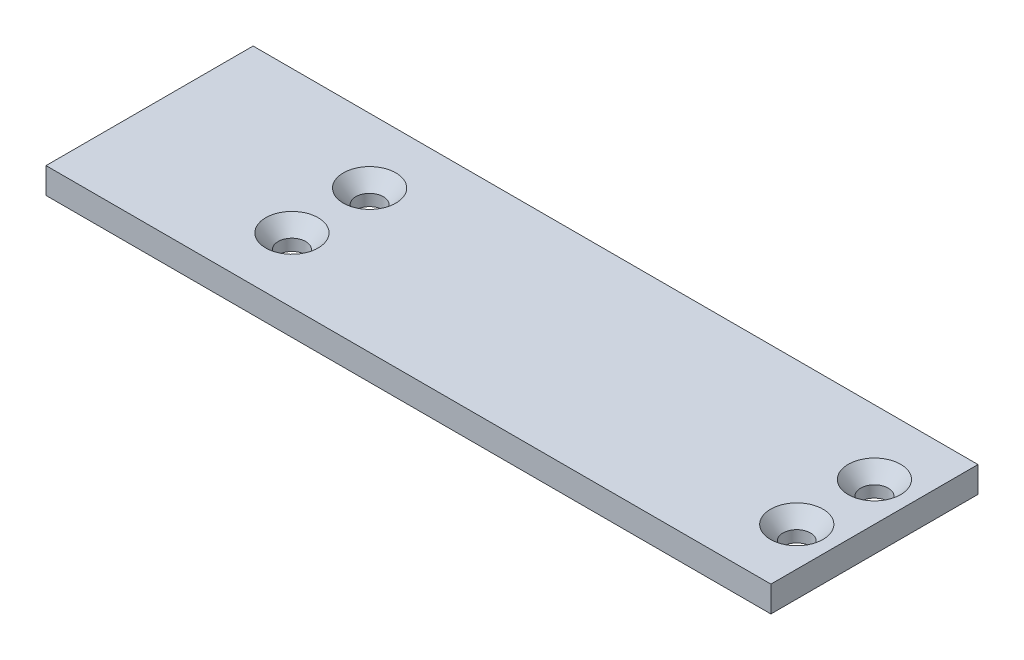
ISO-10303-21;
HEADER;
FILE_DESCRIPTION(('STEP AP214'),'2;1');
FILE_NAME('part.step','',(''),(''),'','','');
FILE_SCHEMA(('AUTOMOTIVE_DESIGN { 1 0 10303 214 1 1 1 1 }'));
ENDSEC;
DATA;
#1=APPLICATION_CONTEXT('core data for automotive mechanical design processes');
#2=APPLICATION_PROTOCOL_DEFINITION('international standard','automotive_design',2000,#1);
#3=PRODUCT_CONTEXT('',#1,'mechanical');
#4=PRODUCT('Part','Part','',(#3));
#5=PRODUCT_RELATED_PRODUCT_CATEGORY('part','',(#4));
#6=PRODUCT_DEFINITION_FORMATION('','',#4);
#7=PRODUCT_DEFINITION_CONTEXT('part definition',#1,'design');
#8=PRODUCT_DEFINITION('design','',#6,#7);
#9=PRODUCT_DEFINITION_SHAPE('','',#8);
#10=(LENGTH_UNIT() NAMED_UNIT(*) SI_UNIT(.MILLI.,.METRE.));
#11=(NAMED_UNIT(*) PLANE_ANGLE_UNIT() SI_UNIT($,.RADIAN.));
#12=(NAMED_UNIT(*) SI_UNIT($,.STERADIAN.) SOLID_ANGLE_UNIT());
#13=UNCERTAINTY_MEASURE_WITH_UNIT(LENGTH_MEASURE(1.E-05),#10,'distance_accuracy_value','');
#14=(GEOMETRIC_REPRESENTATION_CONTEXT(3) GLOBAL_UNCERTAINTY_ASSIGNED_CONTEXT((#13)) GLOBAL_UNIT_ASSIGNED_CONTEXT((#10,
#11,#12)) REPRESENTATION_CONTEXT('',''));
#15=CARTESIAN_POINT('',(0.,0.,0.));
#16=DIRECTION('',(0.,0.,1.));
#17=DIRECTION('',(1.,0.,0.));
#18=AXIS2_PLACEMENT_3D('',#15,#16,#17);
#19=CARTESIAN_POINT('',(-88.9,3.175,25.4));
#20=DIRECTION('',(1.,0.,0.));
#21=DIRECTION('',(0.,0.,-1.));
#22=AXIS2_PLACEMENT_3D('',#19,#20,#21);
#23=PLANE('',#22);
#24=DIRECTION('',(0.,0.,1.));
#25=VECTOR('',#24,1.);
#26=CARTESIAN_POINT('',(-88.9,-3.175,25.4));
#27=LINE('',#26,#25);
#28=CARTESIAN_POINT('',(-88.9,-3.175,-25.4));
#29=VERTEX_POINT('',#28);
#30=CARTESIAN_POINT('',(-88.9,-3.175,25.4));
#31=VERTEX_POINT('',#30);
#32=EDGE_CURVE('E98',#29,#31,#27,.T.);
#33=ORIENTED_EDGE('',*,*,#32,.T.);
#34=DIRECTION('',(0.,-1.,0.));
#35=VECTOR('',#34,1.);
#36=CARTESIAN_POINT('',(-88.9,3.175,25.4));
#37=LINE('',#36,#35);
#38=CARTESIAN_POINT('',(-88.9,3.175,25.4));
#39=VERTEX_POINT('',#38);
#40=EDGE_CURVE('E11',#39,#31,#37,.T.);
#41=ORIENTED_EDGE('',*,*,#40,.F.);
#42=DIRECTION('',(0.,0.,1.));
#43=VECTOR('',#42,1.);
#44=CARTESIAN_POINT('',(-88.9,3.175,25.4));
#45=LINE('',#44,#43);
#46=CARTESIAN_POINT('',(-88.9,3.175,-25.4));
#47=VERTEX_POINT('',#46);
#48=EDGE_CURVE('E85',#47,#39,#45,.T.);
#49=ORIENTED_EDGE('',*,*,#48,.F.);
#50=DIRECTION('',(0.,-1.,0.));
#51=VECTOR('',#50,1.);
#52=CARTESIAN_POINT('',(-88.9,3.175,-25.4));
#53=LINE('',#52,#51);
#54=EDGE_CURVE('E94',#47,#29,#53,.T.);
#55=ORIENTED_EDGE('',*,*,#54,.T.);
#56=EDGE_LOOP('',(#33,#41,#49,#55));
#57=FACE_BOUND('',#56,.T.);
#58=ADVANCED_FACE('F32',(#57),#23,.F.);
#59=CARTESIAN_POINT('',(88.9,3.175,25.4));
#60=DIRECTION('',(0.,0.,-1.));
#61=DIRECTION('',(-1.,0.,0.));
#62=AXIS2_PLACEMENT_3D('',#59,#60,#61);
#63=PLANE('',#62);
#64=DIRECTION('',(1.,0.,0.));
#65=VECTOR('',#64,1.);
#66=CARTESIAN_POINT('',(88.9,-3.175,25.4));
#67=LINE('',#66,#65);
#68=CARTESIAN_POINT('',(88.9,-3.175,25.4));
#69=VERTEX_POINT('',#68);
#70=EDGE_CURVE('E89',#31,#69,#67,.T.);
#71=ORIENTED_EDGE('',*,*,#70,.T.);
#72=DIRECTION('',(0.,-1.,0.));
#73=VECTOR('',#72,1.);
#74=CARTESIAN_POINT('',(88.9,3.175,25.4));
#75=LINE('',#74,#73);
#76=CARTESIAN_POINT('',(88.9,3.175,25.4));
#77=VERTEX_POINT('',#76);
#78=EDGE_CURVE('E41',#77,#69,#75,.T.);
#79=ORIENTED_EDGE('',*,*,#78,.F.);
#80=DIRECTION('',(1.,0.,0.));
#81=VECTOR('',#80,1.);
#82=CARTESIAN_POINT('',(88.9,3.175,25.4));
#83=LINE('',#82,#81);
#84=EDGE_CURVE('E80',#39,#77,#83,.T.);
#85=ORIENTED_EDGE('',*,*,#84,.F.);
#86=ORIENTED_EDGE('',*,*,#40,.T.);
#87=EDGE_LOOP('',(#71,#79,#85,#86));
#88=FACE_BOUND('',#87,.T.);
#89=ADVANCED_FACE('F88',(#88),#63,.F.);
#90=CARTESIAN_POINT('',(88.9,3.175,25.4));
#91=DIRECTION('',(-1.,0.,0.));
#92=DIRECTION('',(0.,0.,1.));
#93=AXIS2_PLACEMENT_3D('',#90,#91,#92);
#94=PLANE('',#93);
#95=DIRECTION('',(0.,0.,-1.));
#96=VECTOR('',#95,1.);
#97=CARTESIAN_POINT('',(88.9,-3.175,25.4));
#98=LINE('',#97,#96);
#99=CARTESIAN_POINT('',(88.9,-3.175,-25.4));
#100=VERTEX_POINT('',#99);
#101=EDGE_CURVE('E67',#69,#100,#98,.T.);
#102=ORIENTED_EDGE('',*,*,#101,.T.);
#103=DIRECTION('',(0.,-1.,0.));
#104=VECTOR('',#103,1.);
#105=CARTESIAN_POINT('',(88.9,3.175,-25.4));
#106=LINE('',#105,#104);
#107=CARTESIAN_POINT('',(88.9,3.175,-25.4));
#108=VERTEX_POINT('',#107);
#109=EDGE_CURVE('E90',#108,#100,#106,.T.);
#110=ORIENTED_EDGE('',*,*,#109,.F.);
#111=DIRECTION('',(0.,0.,-1.));
#112=VECTOR('',#111,1.);
#113=CARTESIAN_POINT('',(88.9,3.175,25.4));
#114=LINE('',#113,#112);
#115=EDGE_CURVE('E83',#77,#108,#114,.T.);
#116=ORIENTED_EDGE('',*,*,#115,.F.);
#117=ORIENTED_EDGE('',*,*,#78,.T.);
#118=EDGE_LOOP('',(#102,#110,#116,#117));
#119=FACE_BOUND('',#118,.T.);
#120=ADVANCED_FACE('F92',(#119),#94,.F.);
#121=CARTESIAN_POINT('',(88.9,3.175,-25.4));
#122=DIRECTION('',(0.,0.,1.));
#123=DIRECTION('',(1.,0.,0.));
#124=AXIS2_PLACEMENT_3D('',#121,#122,#123);
#125=PLANE('',#124);
#126=DIRECTION('',(-1.,0.,0.));
#127=VECTOR('',#126,1.);
#128=CARTESIAN_POINT('',(88.9,-3.175,-25.4));
#129=LINE('',#128,#127);
#130=EDGE_CURVE('E73',#100,#29,#129,.T.);
#131=ORIENTED_EDGE('',*,*,#130,.T.);
#132=ORIENTED_EDGE('',*,*,#54,.F.);
#133=DIRECTION('',(-1.,0.,0.));
#134=VECTOR('',#133,1.);
#135=CARTESIAN_POINT('',(88.9,3.175,-25.4));
#136=LINE('',#135,#134);
#137=EDGE_CURVE('E50',#108,#47,#136,.T.);
#138=ORIENTED_EDGE('',*,*,#137,.F.);
#139=ORIENTED_EDGE('',*,*,#109,.T.);
#140=EDGE_LOOP('',(#131,#132,#138,#139));
#141=FACE_BOUND('',#140,.T.);
#142=ADVANCED_FACE('F150',(#141),#125,.F.);
#143=CARTESIAN_POINT('',(0.,3.175,0.));
#144=DIRECTION('',(0.,1.,0.));
#145=DIRECTION('',(0.,0.,1.));
#146=AXIS2_PLACEMENT_3D('',#143,#144,#145);
#147=PLANE('',#146);
#148=CARTESIAN_POINT('',(-44.45,3.175,-9.52500000000001));
#149=DIRECTION('',(0.,1.,0.));
#150=DIRECTION('',(0.,0.,1.));
#151=AXIS2_PLACEMENT_3D('',#148,#149,#150);
#152=CIRCLE('',#151,6.4389);
#153=CARTESIAN_POINT('',(-44.45,3.175,-3.08610000000001));
#154=VERTEX_POINT('',#153);
#155=EDGE_CURVE('E270',#154,#154,#152,.T.);
#156=ORIENTED_EDGE('',*,*,#155,.F.);
#157=EDGE_LOOP('',(#156));
#158=FACE_BOUND('',#157,.T.);
#159=CARTESIAN_POINT('',(-44.45,3.175,9.52500000000001));
#160=DIRECTION('',(0.,1.,0.));
#161=DIRECTION('',(0.,0.,1.));
#162=AXIS2_PLACEMENT_3D('',#159,#160,#161);
#163=CIRCLE('',#162,6.4389);
#164=CARTESIAN_POINT('',(-44.45,3.175,15.9639));
#165=VERTEX_POINT('',#164);
#166=EDGE_CURVE('E123',#165,#165,#163,.T.);
#167=ORIENTED_EDGE('',*,*,#166,.F.);
#168=EDGE_LOOP('',(#167));
#169=FACE_BOUND('',#168,.T.);
#170=CARTESIAN_POINT('',(79.375,3.175,9.52500000000001));
#171=DIRECTION('',(0.,1.,0.));
#172=DIRECTION('',(0.,0.,1.));
#173=AXIS2_PLACEMENT_3D('',#170,#171,#172);
#174=CIRCLE('',#173,6.4389);
#175=CARTESIAN_POINT('',(79.375,3.175,15.9639));
#176=VERTEX_POINT('',#175);
#177=EDGE_CURVE('E116',#176,#176,#174,.T.);
#178=ORIENTED_EDGE('',*,*,#177,.F.);
#179=EDGE_LOOP('',(#178));
#180=FACE_BOUND('',#179,.T.);
#181=CARTESIAN_POINT('',(79.375,3.175,-9.52500000000001));
#182=DIRECTION('',(0.,1.,0.));
#183=DIRECTION('',(0.,0.,1.));
#184=AXIS2_PLACEMENT_3D('',#181,#182,#183);
#185=CIRCLE('',#184,6.4389);
#186=CARTESIAN_POINT('',(79.375,3.175,-3.08610000000001));
#187=VERTEX_POINT('',#186);
#188=EDGE_CURVE('E112',#187,#187,#185,.T.);
#189=ORIENTED_EDGE('',*,*,#188,.F.);
#190=EDGE_LOOP('',(#189));
#191=FACE_BOUND('',#190,.T.);
#192=ORIENTED_EDGE('',*,*,#48,.T.);
#193=ORIENTED_EDGE('',*,*,#84,.T.);
#194=ORIENTED_EDGE('',*,*,#115,.T.);
#195=ORIENTED_EDGE('',*,*,#137,.T.);
#196=EDGE_LOOP('',(#192,#193,#194,#195));
#197=FACE_BOUND('',#196,.T.);
#198=ADVANCED_FACE('F81',(#158,#169,#180,#191,#197),#147,.T.);
#199=CARTESIAN_POINT('',(0.,-3.175,0.));
#200=DIRECTION('',(0.,1.,0.));
#201=DIRECTION('',(0.,0.,1.));
#202=AXIS2_PLACEMENT_3D('',#199,#200,#201);
#203=PLANE('',#202);
#204=CARTESIAN_POINT('',(-44.45,-3.175,-9.52500000000001));
#205=DIRECTION('',(0.,1.,0.));
#206=DIRECTION('',(0.,0.,1.));
#207=AXIS2_PLACEMENT_3D('',#204,#205,#206);
#208=CIRCLE('',#207,3.37819999999999);
#209=CARTESIAN_POINT('',(-44.45,-3.175,-6.14680000000001));
#210=VERTEX_POINT('',#209);
#211=EDGE_CURVE('E35',#210,#210,#208,.T.);
#212=ORIENTED_EDGE('',*,*,#211,.T.);
#213=EDGE_LOOP('',(#212));
#214=FACE_BOUND('',#213,.T.);
#215=CARTESIAN_POINT('',(-44.45,-3.175,9.52500000000001));
#216=DIRECTION('',(0.,1.,0.));
#217=DIRECTION('',(0.,0.,1.));
#218=AXIS2_PLACEMENT_3D('',#215,#216,#217);
#219=CIRCLE('',#218,3.37819999999999);
#220=CARTESIAN_POINT('',(-44.45,-3.175,12.9032));
#221=VERTEX_POINT('',#220);
#222=EDGE_CURVE('E114',#221,#221,#219,.T.);
#223=ORIENTED_EDGE('',*,*,#222,.T.);
#224=EDGE_LOOP('',(#223));
#225=FACE_BOUND('',#224,.T.);
#226=CARTESIAN_POINT('',(79.375,-3.175,9.52500000000001));
#227=DIRECTION('',(0.,1.,0.));
#228=DIRECTION('',(0.,0.,1.));
#229=AXIS2_PLACEMENT_3D('',#226,#227,#228);
#230=CIRCLE('',#229,3.37819999999999);
#231=CARTESIAN_POINT('',(79.375,-3.175,12.9032));
#232=VERTEX_POINT('',#231);
#233=EDGE_CURVE('E110',#232,#232,#230,.T.);
#234=ORIENTED_EDGE('',*,*,#233,.T.);
#235=EDGE_LOOP('',(#234));
#236=FACE_BOUND('',#235,.T.);
#237=CARTESIAN_POINT('',(79.375,-3.175,-9.52500000000001));
#238=DIRECTION('',(0.,1.,0.));
#239=DIRECTION('',(0.,0.,1.));
#240=AXIS2_PLACEMENT_3D('',#237,#238,#239);
#241=CIRCLE('',#240,3.37819999999999);
#242=CARTESIAN_POINT('',(79.375,-3.175,-6.14680000000001));
#243=VERTEX_POINT('',#242);
#244=EDGE_CURVE('E101',#243,#243,#241,.T.);
#245=ORIENTED_EDGE('',*,*,#244,.T.);
#246=EDGE_LOOP('',(#245));
#247=FACE_BOUND('',#246,.T.);
#248=ORIENTED_EDGE('',*,*,#32,.F.);
#249=ORIENTED_EDGE('',*,*,#130,.F.);
#250=ORIENTED_EDGE('',*,*,#101,.F.);
#251=ORIENTED_EDGE('',*,*,#70,.F.);
#252=EDGE_LOOP('',(#248,#249,#250,#251));
#253=FACE_BOUND('',#252,.T.);
#254=ADVANCED_FACE('F149',(#214,#225,#236,#247,#253),#203,.F.);
#255=CARTESIAN_POINT('',(79.375,3.175,-9.52500000000001));
#256=DIRECTION('',(0.,1.,0.));
#257=DIRECTION('',(0.,0.,1.));
#258=AXIS2_PLACEMENT_3D('',#255,#256,#257);
#259=CYLINDRICAL_SURFACE('',#258,3.37819999999999);
#260=CARTESIAN_POINT('',(79.375,-0.345932583981347,-9.52500000000001));
#261=DIRECTION('',(0.,1.,0.));
#262=DIRECTION('',(0.,0.,1.));
#263=AXIS2_PLACEMENT_3D('',#260,#261,#262);
#264=CIRCLE('',#263,3.3782);
#265=CARTESIAN_POINT('',(79.375,-0.345932583981347,-6.14680000000001));
#266=VERTEX_POINT('',#265);
#267=EDGE_CURVE('E109',#266,#266,#264,.T.);
#268=ORIENTED_EDGE('',*,*,#267,.T.);
#269=EDGE_LOOP('',(#268));
#270=FACE_BOUND('',#269,.T.);
#271=ORIENTED_EDGE('',*,*,#244,.F.);
#272=EDGE_LOOP('',(#271));
#273=FACE_BOUND('',#272,.T.);
#274=ADVANCED_FACE('F138',(#270,#273),#259,.F.);
#275=CARTESIAN_POINT('',(79.375,3.175,-9.52500000000001));
#276=DIRECTION('',(0.,1.,0.));
#277=DIRECTION('',(0.,0.,1.));
#278=AXIS2_PLACEMENT_3D('',#275,#276,#277);
#279=CONICAL_SURFACE('',#278,6.4389,0.715584993317675);
#280=ORIENTED_EDGE('',*,*,#267,.F.);
#281=EDGE_LOOP('',(#280));
#282=FACE_BOUND('',#281,.T.);
#283=ORIENTED_EDGE('',*,*,#188,.T.);
#284=EDGE_LOOP('',(#283));
#285=FACE_BOUND('',#284,.T.);
#286=ADVANCED_FACE('F141',(#282,#285),#279,.F.);
#287=CARTESIAN_POINT('',(79.375,3.175,9.52500000000001));
#288=DIRECTION('',(0.,1.,0.));
#289=DIRECTION('',(0.,0.,1.));
#290=AXIS2_PLACEMENT_3D('',#287,#288,#289);
#291=CYLINDRICAL_SURFACE('',#290,3.37819999999999);
#292=CARTESIAN_POINT('',(79.375,-0.345932583981347,9.52500000000001));
#293=DIRECTION('',(0.,1.,0.));
#294=DIRECTION('',(0.,0.,1.));
#295=AXIS2_PLACEMENT_3D('',#292,#293,#294);
#296=CIRCLE('',#295,3.3782);
#297=CARTESIAN_POINT('',(79.375,-0.345932583981347,12.9032));
#298=VERTEX_POINT('',#297);
#299=EDGE_CURVE('E113',#298,#298,#296,.T.);
#300=ORIENTED_EDGE('',*,*,#299,.T.);
#301=EDGE_LOOP('',(#300));
#302=FACE_BOUND('',#301,.T.);
#303=ORIENTED_EDGE('',*,*,#233,.F.);
#304=EDGE_LOOP('',(#303));
#305=FACE_BOUND('',#304,.T.);
#306=ADVANCED_FACE('F144',(#302,#305),#291,.F.);
#307=CARTESIAN_POINT('',(79.375,3.175,9.52500000000001));
#308=DIRECTION('',(0.,1.,0.));
#309=DIRECTION('',(0.,0.,1.));
#310=AXIS2_PLACEMENT_3D('',#307,#308,#309);
#311=CONICAL_SURFACE('',#310,6.4389,0.715584993317675);
#312=ORIENTED_EDGE('',*,*,#299,.F.);
#313=EDGE_LOOP('',(#312));
#314=FACE_BOUND('',#313,.T.);
#315=ORIENTED_EDGE('',*,*,#177,.T.);
#316=EDGE_LOOP('',(#315));
#317=FACE_BOUND('',#316,.T.);
#318=ADVANCED_FACE('F212',(#314,#317),#311,.F.);
#319=CARTESIAN_POINT('',(-44.45,3.175,9.52500000000001));
#320=DIRECTION('',(0.,1.,0.));
#321=DIRECTION('',(0.,0.,1.));
#322=AXIS2_PLACEMENT_3D('',#319,#320,#321);
#323=CYLINDRICAL_SURFACE('',#322,3.37819999999999);
#324=CARTESIAN_POINT('',(-44.45,-0.345932583981347,9.52500000000001));
#325=DIRECTION('',(0.,1.,0.));
#326=DIRECTION('',(0.,0.,1.));
#327=AXIS2_PLACEMENT_3D('',#324,#325,#326);
#328=CIRCLE('',#327,3.3782);
#329=CARTESIAN_POINT('',(-44.45,-0.345932583981347,12.9032));
#330=VERTEX_POINT('',#329);
#331=EDGE_CURVE('E117',#330,#330,#328,.T.);
#332=ORIENTED_EDGE('',*,*,#331,.T.);
#333=EDGE_LOOP('',(#332));
#334=FACE_BOUND('',#333,.T.);
#335=ORIENTED_EDGE('',*,*,#222,.F.);
#336=EDGE_LOOP('',(#335));
#337=FACE_BOUND('',#336,.T.);
#338=ADVANCED_FACE('F222',(#334,#337),#323,.F.);
#339=CARTESIAN_POINT('',(-44.45,3.175,9.52500000000001));
#340=DIRECTION('',(0.,1.,0.));
#341=DIRECTION('',(0.,0.,1.));
#342=AXIS2_PLACEMENT_3D('',#339,#340,#341);
#343=CONICAL_SURFACE('',#342,6.4389,0.715584993317675);
#344=ORIENTED_EDGE('',*,*,#331,.F.);
#345=EDGE_LOOP('',(#344));
#346=FACE_BOUND('',#345,.T.);
#347=ORIENTED_EDGE('',*,*,#166,.T.);
#348=EDGE_LOOP('',(#347));
#349=FACE_BOUND('',#348,.T.);
#350=ADVANCED_FACE('F232',(#346,#349),#343,.F.);
#351=CARTESIAN_POINT('',(-44.45,3.175,-9.52500000000001));
#352=DIRECTION('',(0.,1.,0.));
#353=DIRECTION('',(0.,0.,1.));
#354=AXIS2_PLACEMENT_3D('',#351,#352,#353);
#355=CYLINDRICAL_SURFACE('',#354,3.37819999999999);
#356=CARTESIAN_POINT('',(-44.45,-0.345932583981347,-9.52500000000001));
#357=DIRECTION('',(0.,1.,0.));
#358=DIRECTION('',(0.,0.,1.));
#359=AXIS2_PLACEMENT_3D('',#356,#357,#358);
#360=CIRCLE('',#359,3.3782);
#361=CARTESIAN_POINT('',(-44.45,-0.345932583981347,-6.14680000000001));
#362=VERTEX_POINT('',#361);
#363=EDGE_CURVE('E268',#362,#362,#360,.T.);
#364=ORIENTED_EDGE('',*,*,#363,.T.);
#365=EDGE_LOOP('',(#364));
#366=FACE_BOUND('',#365,.T.);
#367=ORIENTED_EDGE('',*,*,#211,.F.);
#368=EDGE_LOOP('',(#367));
#369=FACE_BOUND('',#368,.T.);
#370=ADVANCED_FACE('F241',(#366,#369),#355,.F.);
#371=CARTESIAN_POINT('',(-44.45,3.175,-9.52500000000001));
#372=DIRECTION('',(0.,1.,0.));
#373=DIRECTION('',(0.,0.,1.));
#374=AXIS2_PLACEMENT_3D('',#371,#372,#373);
#375=CONICAL_SURFACE('',#374,6.4389,0.715584993317675);
#376=ORIENTED_EDGE('',*,*,#363,.F.);
#377=EDGE_LOOP('',(#376));
#378=FACE_BOUND('',#377,.T.);
#379=ORIENTED_EDGE('',*,*,#155,.T.);
#380=EDGE_LOOP('',(#379));
#381=FACE_BOUND('',#380,.T.);
#382=ADVANCED_FACE('F251',(#378,#381),#375,.F.);
#383=CLOSED_SHELL('',(#58,#89,#120,#142,#198,#254,#274,#286,#306,#318,#338,#350,#370,#382));
#384=MANIFOLD_SOLID_BREP('B2',#383);
#385=ADVANCED_BREP_SHAPE_REPRESENTATION('',(#18,#384),#14);
#386=SHAPE_DEFINITION_REPRESENTATION(#9,#385);
ENDSEC;
END-ISO-10303-21;
